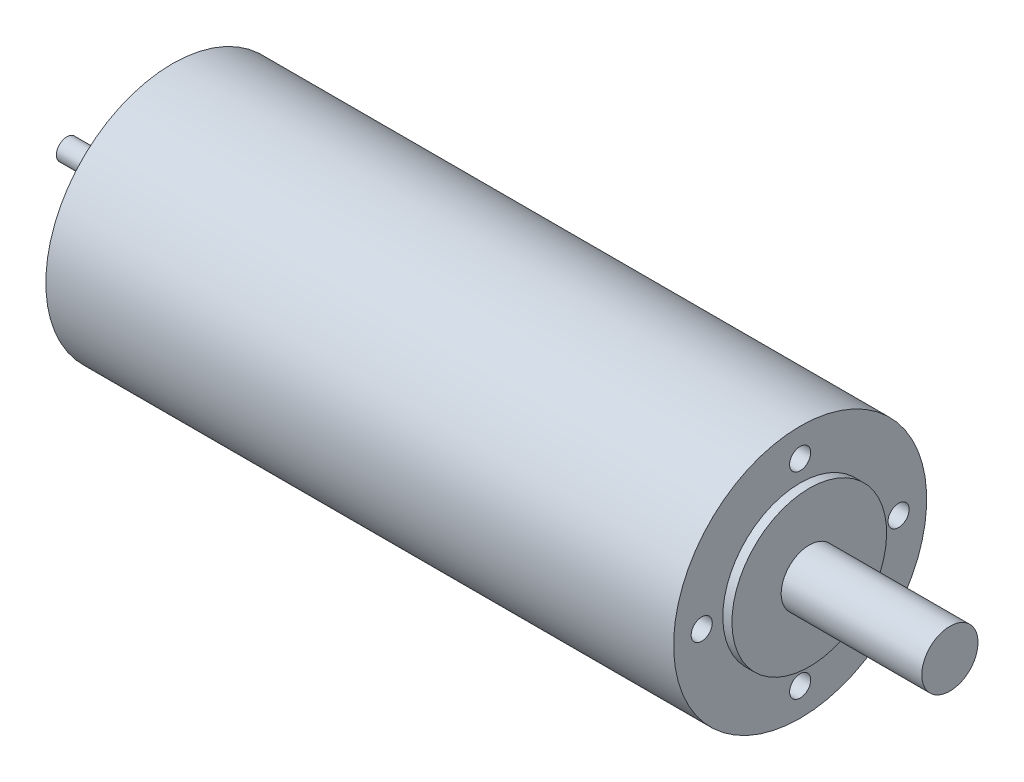
ISO-10303-21;
HEADER;
FILE_DESCRIPTION(('STEP AP214'),'2;1');
FILE_NAME('part.step','',(''),(''),'','','');
FILE_SCHEMA(('AUTOMOTIVE_DESIGN { 1 0 10303 214 1 1 1 1 }'));
ENDSEC;
DATA;
#1=APPLICATION_CONTEXT('core data for automotive mechanical design processes');
#2=APPLICATION_PROTOCOL_DEFINITION('international standard','automotive_design',2000,#1);
#3=PRODUCT_CONTEXT('',#1,'mechanical');
#4=PRODUCT('Part','Part','',(#3));
#5=PRODUCT_RELATED_PRODUCT_CATEGORY('part','',(#4));
#6=PRODUCT_DEFINITION_FORMATION('','',#4);
#7=PRODUCT_DEFINITION_CONTEXT('part definition',#1,'design');
#8=PRODUCT_DEFINITION('design','',#6,#7);
#9=PRODUCT_DEFINITION_SHAPE('','',#8);
#10=(LENGTH_UNIT() NAMED_UNIT(*) SI_UNIT(.MILLI.,.METRE.));
#11=(NAMED_UNIT(*) PLANE_ANGLE_UNIT() SI_UNIT($,.RADIAN.));
#12=(NAMED_UNIT(*) SI_UNIT($,.STERADIAN.) SOLID_ANGLE_UNIT());
#13=UNCERTAINTY_MEASURE_WITH_UNIT(LENGTH_MEASURE(1.E-05),#10,'distance_accuracy_value','');
#14=(GEOMETRIC_REPRESENTATION_CONTEXT(3) GLOBAL_UNCERTAINTY_ASSIGNED_CONTEXT((#13)) GLOBAL_UNIT_ASSIGNED_CONTEXT((#10,
#11,#12)) REPRESENTATION_CONTEXT('',''));
#15=CARTESIAN_POINT('',(0.,0.,0.));
#16=DIRECTION('',(0.,0.,1.));
#17=DIRECTION('',(1.,0.,0.));
#18=AXIS2_PLACEMENT_3D('',#15,#16,#17);
#19=CARTESIAN_POINT('',(-15.,0.,0.));
#20=DIRECTION('',(-1.,0.,0.));
#21=DIRECTION('',(0.,-1.,0.));
#22=AXIS2_PLACEMENT_3D('',#19,#20,#21);
#23=PLANE('',#22);
#24=CARTESIAN_POINT('',(-15.,0.,0.));
#25=DIRECTION('',(-1.,0.,0.));
#26=DIRECTION('',(0.,1.,0.));
#27=AXIS2_PLACEMENT_3D('',#24,#25,#26);
#28=CIRCLE('',#27,1.5);
#29=CARTESIAN_POINT('',(-15.,1.5,0.));
#30=VERTEX_POINT('',#29);
#31=EDGE_CURVE('E73',#30,#30,#28,.T.);
#32=ORIENTED_EDGE('',*,*,#31,.T.);
#33=EDGE_LOOP('',(#32));
#34=FACE_BOUND('',#33,.T.);
#35=ADVANCED_FACE('F39',(#34),#23,.T.);
#36=CARTESIAN_POINT('',(110.6,3.8372083288607E-13,0.));
#37=DIRECTION('',(-1.,0.,0.));
#38=DIRECTION('',(0.,-1.,0.));
#39=AXIS2_PLACEMENT_3D('',#36,#37,#38);
#40=PLANE('',#39);
#41=CARTESIAN_POINT('',(110.6,0.,0.));
#42=DIRECTION('',(-1.,0.,0.));
#43=DIRECTION('',(0.,1.,0.));
#44=AXIS2_PLACEMENT_3D('',#41,#42,#43);
#45=CIRCLE('',#44,4.);
#46=CARTESIAN_POINT('',(110.6,4.00000000000001,0.));
#47=VERTEX_POINT('',#46);
#48=EDGE_CURVE('E10',#47,#47,#45,.T.);
#49=ORIENTED_EDGE('',*,*,#48,.F.);
#50=EDGE_LOOP('',(#49));
#51=FACE_BOUND('',#50,.T.);
#52=ADVANCED_FACE('F113',(#51),#40,.F.);
#53=CARTESIAN_POINT('',(110.6,0.,0.));
#54=DIRECTION('',(1.,0.,0.));
#55=DIRECTION('',(0.,1.,0.));
#56=AXIS2_PLACEMENT_3D('',#53,#54,#55);
#57=CYLINDRICAL_SURFACE('',#56,4.);
#58=ORIENTED_EDGE('',*,*,#48,.T.);
#59=EDGE_LOOP('',(#58));
#60=FACE_BOUND('',#59,.T.);
#61=CARTESIAN_POINT('',(90.6,0.,0.));
#62=DIRECTION('',(-1.,0.,0.));
#63=DIRECTION('',(0.,1.,0.));
#64=AXIS2_PLACEMENT_3D('',#61,#62,#63);
#65=CIRCLE('',#64,4.);
#66=CARTESIAN_POINT('',(90.6,4.00000000000001,0.));
#67=VERTEX_POINT('',#66);
#68=EDGE_CURVE('E45',#67,#67,#65,.T.);
#69=ORIENTED_EDGE('',*,*,#68,.F.);
#70=EDGE_LOOP('',(#69));
#71=FACE_BOUND('',#70,.T.);
#72=ADVANCED_FACE('F118',(#60,#71),#57,.T.);
#73=CARTESIAN_POINT('',(90.6,0.,0.));
#74=DIRECTION('',(-1.,0.,0.));
#75=DIRECTION('',(0.,-1.,0.));
#76=AXIS2_PLACEMENT_3D('',#73,#74,#75);
#77=PLANE('',#76);
#78=ORIENTED_EDGE('',*,*,#68,.T.);
#79=EDGE_LOOP('',(#78));
#80=FACE_BOUND('',#79,.T.);
#81=CARTESIAN_POINT('',(90.6,0.,0.));
#82=DIRECTION('',(-1.,0.,0.));
#83=DIRECTION('',(0.,1.,0.));
#84=AXIS2_PLACEMENT_3D('',#81,#82,#83);
#85=CIRCLE('',#84,11.);
#86=CARTESIAN_POINT('',(90.6,11.,0.));
#87=VERTEX_POINT('',#86);
#88=EDGE_CURVE('E49',#87,#87,#85,.T.);
#89=ORIENTED_EDGE('',*,*,#88,.F.);
#90=EDGE_LOOP('',(#89));
#91=FACE_BOUND('',#90,.T.);
#92=ADVANCED_FACE('F159',(#80,#91),#77,.F.);
#93=CARTESIAN_POINT('',(110.6,0.,0.));
#94=DIRECTION('',(1.,0.,0.));
#95=DIRECTION('',(0.,1.,0.));
#96=AXIS2_PLACEMENT_3D('',#93,#94,#95);
#97=CYLINDRICAL_SURFACE('',#96,11.);
#98=ORIENTED_EDGE('',*,*,#88,.T.);
#99=EDGE_LOOP('',(#98));
#100=FACE_BOUND('',#99,.T.);
#101=CARTESIAN_POINT('',(89.3,0.,0.));
#102=DIRECTION('',(-1.,0.,0.));
#103=DIRECTION('',(0.,1.,0.));
#104=AXIS2_PLACEMENT_3D('',#101,#102,#103);
#105=CIRCLE('',#104,11.);
#106=CARTESIAN_POINT('',(89.3,11.,0.));
#107=VERTEX_POINT('',#106);
#108=EDGE_CURVE('E53',#107,#107,#105,.T.);
#109=ORIENTED_EDGE('',*,*,#108,.F.);
#110=EDGE_LOOP('',(#109));
#111=FACE_BOUND('',#110,.T.);
#112=ADVANCED_FACE('F155',(#100,#111),#97,.T.);
#113=CARTESIAN_POINT('',(89.3,0.,0.));
#114=DIRECTION('',(-1.,0.,0.));
#115=DIRECTION('',(0.,-1.,0.));
#116=AXIS2_PLACEMENT_3D('',#113,#114,#115);
#117=PLANE('',#116);
#118=CARTESIAN_POINT('',(89.3,14.,0.));
#119=DIRECTION('',(-1.,0.,0.));
#120=DIRECTION('',(0.,1.,0.));
#121=AXIS2_PLACEMENT_3D('',#118,#119,#120);
#122=CIRCLE('',#121,1.5);
#123=CARTESIAN_POINT('',(89.3,15.5,0.));
#124=VERTEX_POINT('',#123);
#125=EDGE_CURVE('E95',#124,#124,#122,.T.);
#126=ORIENTED_EDGE('',*,*,#125,.T.);
#127=EDGE_LOOP('',(#126));
#128=FACE_BOUND('',#127,.T.);
#129=CARTESIAN_POINT('',(89.3,0.,14.));
#130=DIRECTION('',(-1.,0.,0.));
#131=DIRECTION('',(0.,1.,0.));
#132=AXIS2_PLACEMENT_3D('',#129,#130,#131);
#133=CIRCLE('',#132,1.5);
#134=CARTESIAN_POINT('',(89.3,1.50000000000001,14.));
#135=VERTEX_POINT('',#134);
#136=EDGE_CURVE('E92',#135,#135,#133,.T.);
#137=ORIENTED_EDGE('',*,*,#136,.T.);
#138=EDGE_LOOP('',(#137));
#139=FACE_BOUND('',#138,.T.);
#140=CARTESIAN_POINT('',(89.3,-14.,0.));
#141=DIRECTION('',(-1.,0.,0.));
#142=DIRECTION('',(0.,1.,0.));
#143=AXIS2_PLACEMENT_3D('',#140,#141,#142);
#144=CIRCLE('',#143,1.5);
#145=CARTESIAN_POINT('',(89.3,-12.5,0.));
#146=VERTEX_POINT('',#145);
#147=EDGE_CURVE('E86',#146,#146,#144,.T.);
#148=ORIENTED_EDGE('',*,*,#147,.T.);
#149=EDGE_LOOP('',(#148));
#150=FACE_BOUND('',#149,.T.);
#151=CARTESIAN_POINT('',(89.3,0.,-14.));
#152=DIRECTION('',(-1.,0.,0.));
#153=DIRECTION('',(0.,1.,0.));
#154=AXIS2_PLACEMENT_3D('',#151,#152,#153);
#155=CIRCLE('',#154,1.5);
#156=CARTESIAN_POINT('',(89.3,1.5,-14.));
#157=VERTEX_POINT('',#156);
#158=EDGE_CURVE('E80',#157,#157,#155,.T.);
#159=ORIENTED_EDGE('',*,*,#158,.T.);
#160=EDGE_LOOP('',(#159));
#161=FACE_BOUND('',#160,.T.);
#162=ORIENTED_EDGE('',*,*,#108,.T.);
#163=EDGE_LOOP('',(#162));
#164=FACE_BOUND('',#163,.T.);
#165=CARTESIAN_POINT('',(89.3,0.,0.));
#166=DIRECTION('',(-1.,0.,0.));
#167=DIRECTION('',(0.,1.,0.));
#168=AXIS2_PLACEMENT_3D('',#165,#166,#167);
#169=CIRCLE('',#168,18.);
#170=CARTESIAN_POINT('',(89.3,18.,0.));
#171=VERTEX_POINT('',#170);
#172=EDGE_CURVE('E58',#171,#171,#169,.T.);
#173=ORIENTED_EDGE('',*,*,#172,.F.);
#174=EDGE_LOOP('',(#173));
#175=FACE_BOUND('',#174,.T.);
#176=ADVANCED_FACE('F149',(#128,#139,#150,#161,#164,#175),#117,.F.);
#177=CARTESIAN_POINT('',(110.6,0.,0.));
#178=DIRECTION('',(1.,0.,0.));
#179=DIRECTION('',(0.,1.,0.));
#180=AXIS2_PLACEMENT_3D('',#177,#178,#179);
#181=CYLINDRICAL_SURFACE('',#180,18.);
#182=ORIENTED_EDGE('',*,*,#172,.T.);
#183=EDGE_LOOP('',(#182));
#184=FACE_BOUND('',#183,.T.);
#185=CARTESIAN_POINT('',(0.,0.,0.));
#186=DIRECTION('',(-1.,0.,0.));
#187=DIRECTION('',(0.,1.,0.));
#188=AXIS2_PLACEMENT_3D('',#185,#186,#187);
#189=CIRCLE('',#188,18.);
#190=CARTESIAN_POINT('',(0.,18.,0.));
#191=VERTEX_POINT('',#190);
#192=EDGE_CURVE('E61',#191,#191,#189,.T.);
#193=ORIENTED_EDGE('',*,*,#192,.F.);
#194=EDGE_LOOP('',(#193));
#195=FACE_BOUND('',#194,.T.);
#196=ADVANCED_FACE('F143',(#184,#195),#181,.T.);
#197=CARTESIAN_POINT('',(0.,0.,0.));
#198=DIRECTION('',(1.,0.,0.));
#199=DIRECTION('',(0.,1.,0.));
#200=AXIS2_PLACEMENT_3D('',#197,#198,#199);
#201=PLANE('',#200);
#202=ORIENTED_EDGE('',*,*,#192,.T.);
#203=EDGE_LOOP('',(#202));
#204=FACE_BOUND('',#203,.T.);
#205=CARTESIAN_POINT('',(0.,0.,0.));
#206=DIRECTION('',(-1.,0.,0.));
#207=DIRECTION('',(0.,1.,0.));
#208=AXIS2_PLACEMENT_3D('',#205,#206,#207);
#209=CIRCLE('',#208,12.);
#210=CARTESIAN_POINT('',(0.,12.,0.));
#211=VERTEX_POINT('',#210);
#212=EDGE_CURVE('E64',#211,#211,#209,.T.);
#213=ORIENTED_EDGE('',*,*,#212,.F.);
#214=EDGE_LOOP('',(#213));
#215=FACE_BOUND('',#214,.T.);
#216=ADVANCED_FACE('F138',(#204,#215),#201,.F.);
#217=CARTESIAN_POINT('',(110.6,0.,0.));
#218=DIRECTION('',(1.,0.,0.));
#219=DIRECTION('',(0.,1.,0.));
#220=AXIS2_PLACEMENT_3D('',#217,#218,#219);
#221=CYLINDRICAL_SURFACE('',#220,12.);
#222=CARTESIAN_POINT('',(-4.,0.,0.));
#223=DIRECTION('',(-1.,0.,0.));
#224=DIRECTION('',(0.,1.,0.));
#225=AXIS2_PLACEMENT_3D('',#222,#223,#224);
#226=CIRCLE('',#225,12.);
#227=CARTESIAN_POINT('',(-4.,12.,0.));
#228=VERTEX_POINT('',#227);
#229=EDGE_CURVE('E67',#228,#228,#226,.T.);
#230=ORIENTED_EDGE('',*,*,#229,.F.);
#231=EDGE_LOOP('',(#230));
#232=FACE_BOUND('',#231,.T.);
#233=ORIENTED_EDGE('',*,*,#212,.T.);
#234=EDGE_LOOP('',(#233));
#235=FACE_BOUND('',#234,.T.);
#236=ADVANCED_FACE('F132',(#232,#235),#221,.T.);
#237=CARTESIAN_POINT('',(-4.,0.,0.));
#238=DIRECTION('',(-1.,0.,0.));
#239=DIRECTION('',(0.,-1.,0.));
#240=AXIS2_PLACEMENT_3D('',#237,#238,#239);
#241=PLANE('',#240);
#242=CARTESIAN_POINT('',(-4.,0.,0.));
#243=DIRECTION('',(-1.,0.,0.));
#244=DIRECTION('',(0.,1.,0.));
#245=AXIS2_PLACEMENT_3D('',#242,#243,#244);
#246=CIRCLE('',#245,1.5);
#247=CARTESIAN_POINT('',(-4.,1.5,0.));
#248=VERTEX_POINT('',#247);
#249=EDGE_CURVE('E70',#248,#248,#246,.T.);
#250=ORIENTED_EDGE('',*,*,#249,.F.);
#251=EDGE_LOOP('',(#250));
#252=FACE_BOUND('',#251,.T.);
#253=ORIENTED_EDGE('',*,*,#229,.T.);
#254=EDGE_LOOP('',(#253));
#255=FACE_BOUND('',#254,.T.);
#256=ADVANCED_FACE('F126',(#252,#255),#241,.T.);
#257=CARTESIAN_POINT('',(110.6,0.,0.));
#258=DIRECTION('',(1.,0.,0.));
#259=DIRECTION('',(0.,1.,0.));
#260=AXIS2_PLACEMENT_3D('',#257,#258,#259);
#261=CYLINDRICAL_SURFACE('',#260,1.5);
#262=ORIENTED_EDGE('',*,*,#31,.F.);
#263=EDGE_LOOP('',(#262));
#264=FACE_BOUND('',#263,.T.);
#265=ORIENTED_EDGE('',*,*,#249,.T.);
#266=EDGE_LOOP('',(#265));
#267=FACE_BOUND('',#266,.T.);
#268=ADVANCED_FACE('F122',(#264,#267),#261,.T.);
#269=CARTESIAN_POINT('',(79.3,0.,-14.));
#270=DIRECTION('',(1.,0.,0.));
#271=DIRECTION('',(0.,1.,0.));
#272=AXIS2_PLACEMENT_3D('',#269,#270,#271);
#273=CYLINDRICAL_SURFACE('',#272,1.5);
#274=CARTESIAN_POINT('',(79.3,0.,-14.));
#275=DIRECTION('',(-1.,0.,0.));
#276=DIRECTION('',(0.,1.,0.));
#277=AXIS2_PLACEMENT_3D('',#274,#275,#276);
#278=CIRCLE('',#277,1.5);
#279=CARTESIAN_POINT('',(79.3,1.5,-14.));
#280=VERTEX_POINT('',#279);
#281=EDGE_CURVE('E77',#280,#280,#278,.T.);
#282=ORIENTED_EDGE('',*,*,#281,.T.);
#283=EDGE_LOOP('',(#282));
#284=FACE_BOUND('',#283,.T.);
#285=ORIENTED_EDGE('',*,*,#158,.F.);
#286=EDGE_LOOP('',(#285));
#287=FACE_BOUND('',#286,.T.);
#288=ADVANCED_FACE('F125',(#284,#287),#273,.F.);
#289=CARTESIAN_POINT('',(79.3,0.,-14.));
#290=DIRECTION('',(1.,0.,0.));
#291=DIRECTION('',(0.,1.,0.));
#292=AXIS2_PLACEMENT_3D('',#289,#290,#291);
#293=PLANE('',#292);
#294=ORIENTED_EDGE('',*,*,#281,.F.);
#295=EDGE_LOOP('',(#294));
#296=FACE_BOUND('',#295,.T.);
#297=ADVANCED_FACE('F221',(#296),#293,.T.);
#298=CARTESIAN_POINT('',(79.3,-14.,0.));
#299=DIRECTION('',(1.,0.,0.));
#300=DIRECTION('',(0.,1.,0.));
#301=AXIS2_PLACEMENT_3D('',#298,#299,#300);
#302=CYLINDRICAL_SURFACE('',#301,1.5);
#303=CARTESIAN_POINT('',(79.3,-14.,0.));
#304=DIRECTION('',(-1.,0.,0.));
#305=DIRECTION('',(0.,1.,0.));
#306=AXIS2_PLACEMENT_3D('',#303,#304,#305);
#307=CIRCLE('',#306,1.5);
#308=CARTESIAN_POINT('',(79.3,-12.5,0.));
#309=VERTEX_POINT('',#308);
#310=EDGE_CURVE('E83',#309,#309,#307,.T.);
#311=ORIENTED_EDGE('',*,*,#310,.T.);
#312=EDGE_LOOP('',(#311));
#313=FACE_BOUND('',#312,.T.);
#314=ORIENTED_EDGE('',*,*,#147,.F.);
#315=EDGE_LOOP('',(#314));
#316=FACE_BOUND('',#315,.T.);
#317=ADVANCED_FACE('F232',(#313,#316),#302,.F.);
#318=CARTESIAN_POINT('',(79.3,-14.,0.));
#319=DIRECTION('',(1.,0.,0.));
#320=DIRECTION('',(0.,1.,0.));
#321=AXIS2_PLACEMENT_3D('',#318,#319,#320);
#322=PLANE('',#321);
#323=ORIENTED_EDGE('',*,*,#310,.F.);
#324=EDGE_LOOP('',(#323));
#325=FACE_BOUND('',#324,.T.);
#326=ADVANCED_FACE('F243',(#325),#322,.T.);
#327=CARTESIAN_POINT('',(79.3,0.,14.));
#328=DIRECTION('',(1.,0.,0.));
#329=DIRECTION('',(0.,1.,0.));
#330=AXIS2_PLACEMENT_3D('',#327,#328,#329);
#331=CYLINDRICAL_SURFACE('',#330,1.5);
#332=CARTESIAN_POINT('',(79.3,0.,14.));
#333=DIRECTION('',(-1.,0.,0.));
#334=DIRECTION('',(0.,1.,0.));
#335=AXIS2_PLACEMENT_3D('',#332,#333,#334);
#336=CIRCLE('',#335,1.5);
#337=CARTESIAN_POINT('',(79.3,1.50000000000001,14.));
#338=VERTEX_POINT('',#337);
#339=EDGE_CURVE('E89',#338,#338,#336,.T.);
#340=ORIENTED_EDGE('',*,*,#339,.T.);
#341=EDGE_LOOP('',(#340));
#342=FACE_BOUND('',#341,.T.);
#343=ORIENTED_EDGE('',*,*,#136,.F.);
#344=EDGE_LOOP('',(#343));
#345=FACE_BOUND('',#344,.T.);
#346=ADVANCED_FACE('F254',(#342,#345),#331,.F.);
#347=CARTESIAN_POINT('',(79.3,0.,14.));
#348=DIRECTION('',(1.,0.,0.));
#349=DIRECTION('',(0.,1.,0.));
#350=AXIS2_PLACEMENT_3D('',#347,#348,#349);
#351=PLANE('',#350);
#352=ORIENTED_EDGE('',*,*,#339,.F.);
#353=EDGE_LOOP('',(#352));
#354=FACE_BOUND('',#353,.T.);
#355=ADVANCED_FACE('F110',(#354),#351,.T.);
#356=CARTESIAN_POINT('',(79.3,14.,0.));
#357=DIRECTION('',(1.,0.,0.));
#358=DIRECTION('',(0.,1.,0.));
#359=AXIS2_PLACEMENT_3D('',#356,#357,#358);
#360=CYLINDRICAL_SURFACE('',#359,1.5);
#361=CARTESIAN_POINT('',(79.3,14.,0.));
#362=DIRECTION('',(-1.,0.,0.));
#363=DIRECTION('',(0.,1.,0.));
#364=AXIS2_PLACEMENT_3D('',#361,#362,#363);
#365=CIRCLE('',#364,1.5);
#366=CARTESIAN_POINT('',(79.3,15.5,0.));
#367=VERTEX_POINT('',#366);
#368=EDGE_CURVE('E76',#367,#367,#365,.T.);
#369=ORIENTED_EDGE('',*,*,#368,.T.);
#370=EDGE_LOOP('',(#369));
#371=FACE_BOUND('',#370,.T.);
#372=ORIENTED_EDGE('',*,*,#125,.F.);
#373=EDGE_LOOP('',(#372));
#374=FACE_BOUND('',#373,.T.);
#375=ADVANCED_FACE('F101',(#371,#374),#360,.F.);
#376=CARTESIAN_POINT('',(79.3,14.,0.));
#377=DIRECTION('',(1.,0.,0.));
#378=DIRECTION('',(0.,1.,0.));
#379=AXIS2_PLACEMENT_3D('',#376,#377,#378);
#380=PLANE('',#379);
#381=ORIENTED_EDGE('',*,*,#368,.F.);
#382=EDGE_LOOP('',(#381));
#383=FACE_BOUND('',#382,.T.);
#384=ADVANCED_FACE('F104',(#383),#380,.T.);
#385=CLOSED_SHELL('',(#35,#52,#72,#92,#112,#176,#196,#216,#236,#256,#268,#288,#297,#317,#326,
#346,#355,#375,#384));
#386=MANIFOLD_SOLID_BREP('B2',#385);
#387=ADVANCED_BREP_SHAPE_REPRESENTATION('',(#18,#386),#14);
#388=SHAPE_DEFINITION_REPRESENTATION(#9,#387);
ENDSEC;
END-ISO-10303-21;
